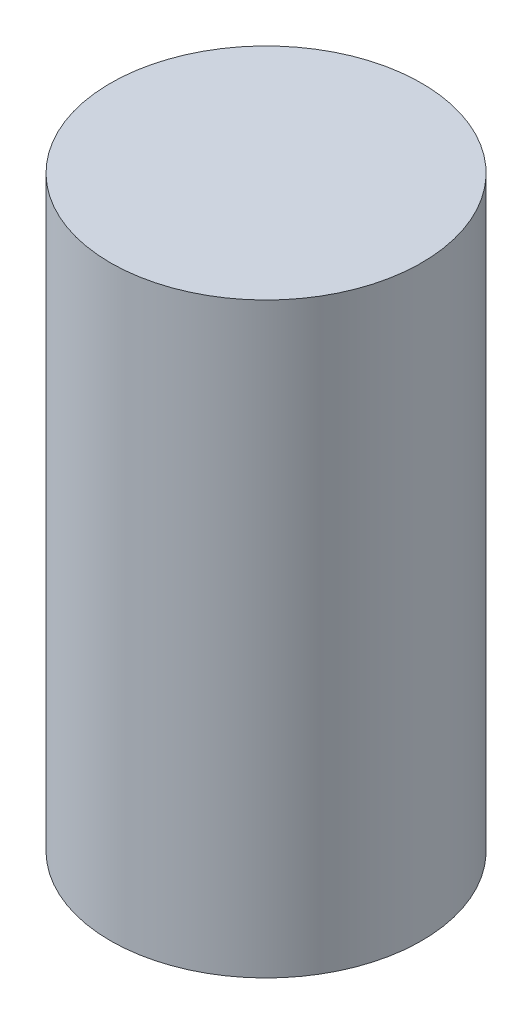
ISO-10303-21;
HEADER;
FILE_DESCRIPTION(('STEP AP214'),'2;1');
FILE_NAME('part.step','',(''),(''),'','','');
FILE_SCHEMA(('AUTOMOTIVE_DESIGN { 1 0 10303 214 1 1 1 1 }'));
ENDSEC;
DATA;
#1=APPLICATION_CONTEXT('core data for automotive mechanical design processes');
#2=APPLICATION_PROTOCOL_DEFINITION('international standard','automotive_design',2000,#1);
#3=PRODUCT_CONTEXT('',#1,'mechanical');
#4=PRODUCT('Part','Part','',(#3));
#5=PRODUCT_RELATED_PRODUCT_CATEGORY('part','',(#4));
#6=PRODUCT_DEFINITION_FORMATION('','',#4);
#7=PRODUCT_DEFINITION_CONTEXT('part definition',#1,'design');
#8=PRODUCT_DEFINITION('design','',#6,#7);
#9=PRODUCT_DEFINITION_SHAPE('','',#8);
#10=(LENGTH_UNIT() NAMED_UNIT(*) SI_UNIT(.MILLI.,.METRE.));
#11=(NAMED_UNIT(*) PLANE_ANGLE_UNIT() SI_UNIT($,.RADIAN.));
#12=(NAMED_UNIT(*) SI_UNIT($,.STERADIAN.) SOLID_ANGLE_UNIT());
#13=UNCERTAINTY_MEASURE_WITH_UNIT(LENGTH_MEASURE(1.E-05),#10,'distance_accuracy_value','');
#14=(GEOMETRIC_REPRESENTATION_CONTEXT(3) GLOBAL_UNCERTAINTY_ASSIGNED_CONTEXT((#13)) GLOBAL_UNIT_ASSIGNED_CONTEXT((#10,
#11,#12)) REPRESENTATION_CONTEXT('',''));
#15=CARTESIAN_POINT('',(0.,0.,0.));
#16=DIRECTION('',(0.,0.,1.));
#17=DIRECTION('',(1.,0.,0.));
#18=AXIS2_PLACEMENT_3D('',#15,#16,#17);
#19=CARTESIAN_POINT('',(0.,195.2625,0.));
#20=DIRECTION('',(0.,-1.,0.));
#21=DIRECTION('',(0.,0.,-1.));
#22=AXIS2_PLACEMENT_3D('',#19,#20,#21);
#23=PLANE('',#22);
#24=CARTESIAN_POINT('',(0.,195.2625,0.));
#25=DIRECTION('',(0.,1.,0.));
#26=DIRECTION('',(0.,0.,1.));
#27=AXIS2_PLACEMENT_3D('',#24,#25,#26);
#28=CIRCLE('',#27,103.5);
#29=CARTESIAN_POINT('',(0.,195.2625,103.5));
#30=VERTEX_POINT('',#29);
#31=EDGE_CURVE('E10',#30,#30,#28,.T.);
#32=ORIENTED_EDGE('',*,*,#31,.T.);
#33=EDGE_LOOP('',(#32));
#34=FACE_BOUND('',#33,.T.);
#35=ADVANCED_FACE('F35',(#34),#23,.F.);
#36=CARTESIAN_POINT('',(0.,0.,0.));
#37=DIRECTION('',(0.,1.,0.));
#38=DIRECTION('',(0.,0.,1.));
#39=AXIS2_PLACEMENT_3D('',#36,#37,#38);
#40=CYLINDRICAL_SURFACE('',#39,103.5);
#41=ORIENTED_EDGE('',*,*,#31,.F.);
#42=EDGE_LOOP('',(#41));
#43=FACE_BOUND('',#42,.T.);
#44=CARTESIAN_POINT('',(0.,-195.2625,0.));
#45=DIRECTION('',(0.,1.,0.));
#46=DIRECTION('',(0.,0.,1.));
#47=AXIS2_PLACEMENT_3D('',#44,#45,#46);
#48=CIRCLE('',#47,103.5);
#49=CARTESIAN_POINT('',(0.,-195.2625,103.5));
#50=VERTEX_POINT('',#49);
#51=EDGE_CURVE('E42',#50,#50,#48,.T.);
#52=ORIENTED_EDGE('',*,*,#51,.T.);
#53=EDGE_LOOP('',(#52));
#54=FACE_BOUND('',#53,.T.);
#55=ADVANCED_FACE('F76',(#43,#54),#40,.T.);
#56=CARTESIAN_POINT('',(0.,-195.2625,-103.5));
#57=DIRECTION('',(0.,1.,0.));
#58=DIRECTION('',(0.,0.,1.));
#59=AXIS2_PLACEMENT_3D('',#56,#57,#58);
#60=PLANE('',#59);
#61=ORIENTED_EDGE('',*,*,#51,.F.);
#62=EDGE_LOOP('',(#61));
#63=FACE_BOUND('',#62,.T.);
#64=ADVANCED_FACE('F75',(#63),#60,.F.);
#65=CLOSED_SHELL('',(#35,#55,#64));
#66=CARTESIAN_POINT('',(0.,-183.5531,0.));
#67=DIRECTION('',(0.,-1.,0.));
#68=DIRECTION('',(0.,0.,-1.));
#69=AXIS2_PLACEMENT_3D('',#66,#67,#68);
#70=PLANE('',#69);
#71=CARTESIAN_POINT('',(0.,-183.5531,0.));
#72=DIRECTION('',(0.,1.,0.));
#73=DIRECTION('',(0.,0.,1.));
#74=AXIS2_PLACEMENT_3D('',#71,#72,#73);
#75=CIRCLE('',#74,91.7906);
#76=CARTESIAN_POINT('',(0.,-183.5531,91.7906));
#77=VERTEX_POINT('',#76);
#78=EDGE_CURVE('E46',#77,#77,#75,.T.);
#79=ORIENTED_EDGE('',*,*,#78,.T.);
#80=EDGE_LOOP('',(#79));
#81=FACE_BOUND('',#80,.T.);
#82=ADVANCED_FACE('F65',(#81),#70,.F.);
#83=CARTESIAN_POINT('',(0.,0.,0.));
#84=DIRECTION('',(0.,1.,0.));
#85=DIRECTION('',(0.,0.,1.));
#86=AXIS2_PLACEMENT_3D('',#83,#84,#85);
#87=CYLINDRICAL_SURFACE('',#86,91.7906);
#88=ORIENTED_EDGE('',*,*,#78,.F.);
#89=EDGE_LOOP('',(#88));
#90=FACE_BOUND('',#89,.T.);
#91=CARTESIAN_POINT('',(0.,183.5531,0.));
#92=DIRECTION('',(0.,1.,0.));
#93=DIRECTION('',(0.,0.,1.));
#94=AXIS2_PLACEMENT_3D('',#91,#92,#93);
#95=CIRCLE('',#94,91.7906);
#96=CARTESIAN_POINT('',(0.,183.5531,91.7906));
#97=VERTEX_POINT('',#96);
#98=EDGE_CURVE('E50',#97,#97,#95,.T.);
#99=ORIENTED_EDGE('',*,*,#98,.T.);
#100=EDGE_LOOP('',(#99));
#101=FACE_BOUND('',#100,.T.);
#102=ADVANCED_FACE('F56',(#90,#101),#87,.F.);
#103=CARTESIAN_POINT('',(0.,183.5531,-91.7906));
#104=DIRECTION('',(0.,1.,0.));
#105=DIRECTION('',(0.,0.,1.));
#106=AXIS2_PLACEMENT_3D('',#103,#104,#105);
#107=PLANE('',#106);
#108=ORIENTED_EDGE('',*,*,#98,.F.);
#109=EDGE_LOOP('',(#108));
#110=FACE_BOUND('',#109,.T.);
#111=ADVANCED_FACE('F58',(#110),#107,.F.);
#112=CLOSED_SHELL('',(#82,#102,#111));
#113=ORIENTED_CLOSED_SHELL('',*,#112,.T.);
#114=BREP_WITH_VOIDS('B2',#65,(#113));
#115=ADVANCED_BREP_SHAPE_REPRESENTATION('',(#18,#114),#14);
#116=SHAPE_DEFINITION_REPRESENTATION(#9,#115);
ENDSEC;
END-ISO-10303-21;
